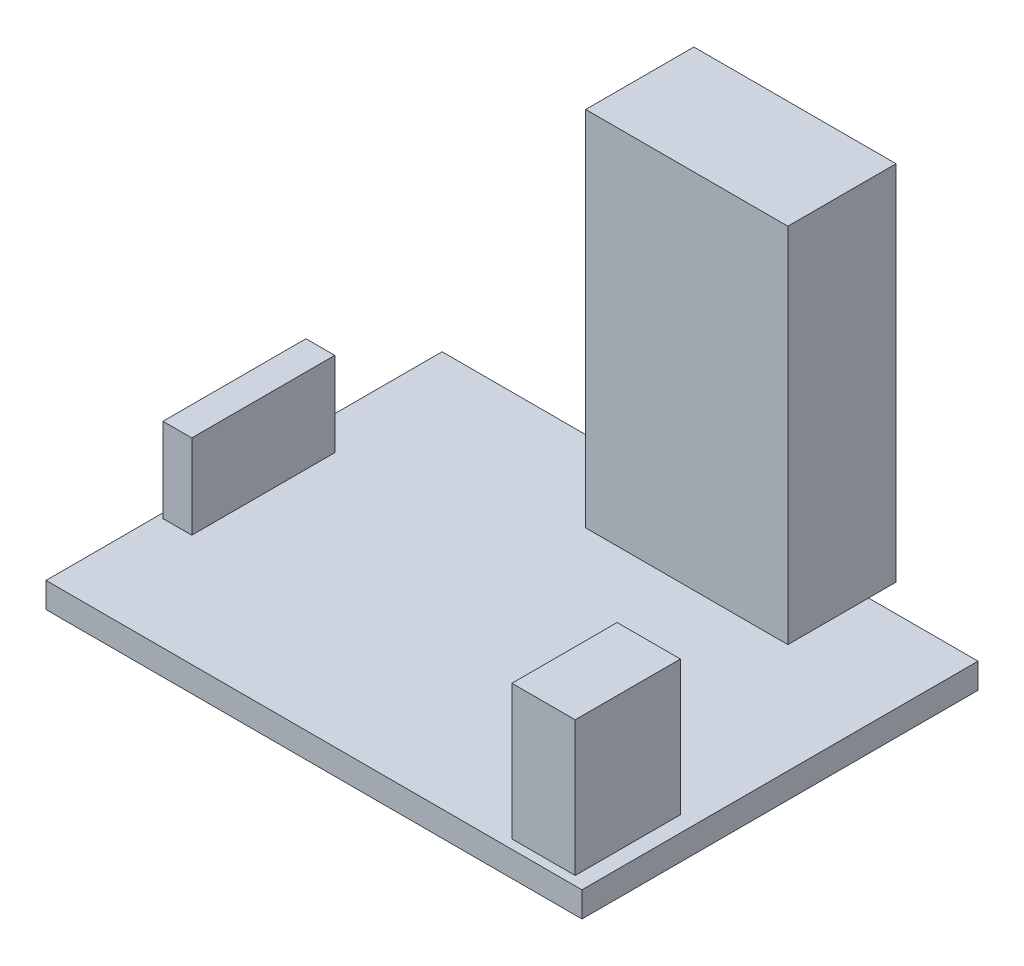
ISO-10303-21;
HEADER;
FILE_DESCRIPTION(('STEP AP214'),'2;1');
FILE_NAME('part.step','',(''),(''),'','','');
FILE_SCHEMA(('AUTOMOTIVE_DESIGN { 1 0 10303 214 1 1 1 1 }'));
ENDSEC;
DATA;
#1=APPLICATION_CONTEXT('core data for automotive mechanical design processes');
#2=APPLICATION_PROTOCOL_DEFINITION('international standard','automotive_design',2000,#1);
#3=PRODUCT_CONTEXT('',#1,'mechanical');
#4=PRODUCT('Part','Part','',(#3));
#5=PRODUCT_RELATED_PRODUCT_CATEGORY('part','',(#4));
#6=PRODUCT_DEFINITION_FORMATION('','',#4);
#7=PRODUCT_DEFINITION_CONTEXT('part definition',#1,'design');
#8=PRODUCT_DEFINITION('design','',#6,#7);
#9=PRODUCT_DEFINITION_SHAPE('','',#8);
#10=(LENGTH_UNIT() NAMED_UNIT(*) SI_UNIT(.MILLI.,.METRE.));
#11=(NAMED_UNIT(*) PLANE_ANGLE_UNIT() SI_UNIT($,.RADIAN.));
#12=(NAMED_UNIT(*) SI_UNIT($,.STERADIAN.) SOLID_ANGLE_UNIT());
#13=UNCERTAINTY_MEASURE_WITH_UNIT(LENGTH_MEASURE(1.E-05),#10,'distance_accuracy_value','');
#14=(GEOMETRIC_REPRESENTATION_CONTEXT(3) GLOBAL_UNCERTAINTY_ASSIGNED_CONTEXT((#13)) GLOBAL_UNIT_ASSIGNED_CONTEXT((#10,
#11,#12)) REPRESENTATION_CONTEXT('',''));
#15=CARTESIAN_POINT('',(0.,0.,0.));
#16=DIRECTION('',(0.,0.,1.));
#17=DIRECTION('',(1.,0.,0.));
#18=AXIS2_PLACEMENT_3D('',#15,#16,#17);
#19=CARTESIAN_POINT('',(0.,1.5,0.));
#20=DIRECTION('',(0.,1.,0.));
#21=DIRECTION('',(0.,0.,1.));
#22=AXIS2_PLACEMENT_3D('',#19,#20,#21);
#23=PLANE('',#22);
#24=DIRECTION('',(1.,0.,0.));
#25=VECTOR('',#24,1.);
#26=CARTESIAN_POINT('',(0.293052926155996,1.5,16.8542686501201));
#27=LINE('',#26,#25);
#28=CARTESIAN_POINT('',(0.293052926155996,1.5,16.8542686501201));
#29=VERTEX_POINT('',#28);
#30=CARTESIAN_POINT('',(2.00371052825782,1.5,16.8542686501201));
#31=VERTEX_POINT('',#30);
#32=EDGE_CURVE('E224',#29,#31,#27,.T.);
#33=ORIENTED_EDGE('',*,*,#32,.F.);
#34=DIRECTION('',(0.,0.,1.));
#35=VECTOR('',#34,1.);
#36=CARTESIAN_POINT('',(0.293052926155996,1.5,8.36762963709548));
#37=LINE('',#36,#35);
#38=CARTESIAN_POINT('',(0.293052926155996,1.5,8.36762963709548));
#39=VERTEX_POINT('',#38);
#40=EDGE_CURVE('E210',#39,#29,#37,.T.);
#41=ORIENTED_EDGE('',*,*,#40,.F.);
#42=DIRECTION('',(-1.,0.,0.));
#43=VECTOR('',#42,1.);
#44=CARTESIAN_POINT('',(0.293052926155996,1.5,8.36762963709548));
#45=LINE('',#44,#43);
#46=CARTESIAN_POINT('',(2.00371052825782,1.5,8.36762963709548));
#47=VERTEX_POINT('',#46);
#48=EDGE_CURVE('E215',#47,#39,#45,.T.);
#49=ORIENTED_EDGE('',*,*,#48,.F.);
#50=DIRECTION('',(0.,0.,-1.));
#51=VECTOR('',#50,1.);
#52=CARTESIAN_POINT('',(2.00371052825782,1.5,8.36762963709548));
#53=LINE('',#52,#51);
#54=EDGE_CURVE('E226',#31,#47,#53,.T.);
#55=ORIENTED_EDGE('',*,*,#54,.F.);
#56=EDGE_LOOP('',(#33,#41,#49,#55));
#57=FACE_BOUND('',#56,.T.);
#58=DIRECTION('',(-1.,0.,0.));
#59=VECTOR('',#58,1.);
#60=CARTESIAN_POINT('',(30.8627264390405,1.5,16.7209706551511));
#61=LINE('',#60,#59);
#62=CARTESIAN_POINT('',(30.8627264390405,1.5,16.7209706551511));
#63=VERTEX_POINT('',#62);
#64=CARTESIAN_POINT('',(27.1081662474144,1.5,16.7209706551511));
#65=VERTEX_POINT('',#64);
#66=EDGE_CURVE('E179',#63,#65,#61,.T.);
#67=ORIENTED_EDGE('',*,*,#66,.F.);
#68=DIRECTION('',(0.,0.,-1.));
#69=VECTOR('',#68,1.);
#70=CARTESIAN_POINT('',(30.8627264390405,1.5,16.7209706551511));
#71=LINE('',#70,#69);
#72=CARTESIAN_POINT('',(30.8627264390405,1.5,22.9637600861981));
#73=VERTEX_POINT('',#72);
#74=EDGE_CURVE('E176',#73,#63,#71,.T.);
#75=ORIENTED_EDGE('',*,*,#74,.F.);
#76=DIRECTION('',(1.,0.,0.));
#77=VECTOR('',#76,1.);
#78=CARTESIAN_POINT('',(30.8627264390405,1.5,22.9637600861981));
#79=LINE('',#78,#77);
#80=CARTESIAN_POINT('',(27.1081662474144,1.5,22.9637600861981));
#81=VERTEX_POINT('',#80);
#82=EDGE_CURVE('E189',#81,#73,#79,.T.);
#83=ORIENTED_EDGE('',*,*,#82,.F.);
#84=DIRECTION('',(0.,0.,1.));
#85=VECTOR('',#84,1.);
#86=CARTESIAN_POINT('',(27.1081662474144,1.5,16.7209706551511));
#87=LINE('',#86,#85);
#88=EDGE_CURVE('E197',#65,#81,#87,.T.);
#89=ORIENTED_EDGE('',*,*,#88,.F.);
#90=EDGE_LOOP('',(#67,#75,#83,#89));
#91=FACE_BOUND('',#90,.T.);
#92=DIRECTION('',(1.,0.,0.));
#93=VECTOR('',#92,1.);
#94=CARTESIAN_POINT('',(13.3118237681257,1.5,4.79080010542806));
#95=LINE('',#94,#93);
#96=CARTESIAN_POINT('',(13.3118237681257,1.5,4.79080010542806));
#97=VERTEX_POINT('',#96);
#98=CARTESIAN_POINT('',(25.3086433153333,1.5,4.79080010542806));
#99=VERTEX_POINT('',#98);
#100=EDGE_CURVE('E48',#97,#99,#95,.T.);
#101=ORIENTED_EDGE('',*,*,#100,.F.);
#102=DIRECTION('',(0.,0.,1.));
#103=VECTOR('',#102,1.);
#104=CARTESIAN_POINT('',(13.3118237681257,1.5,4.79080010542806));
#105=LINE('',#104,#103);
#106=CARTESIAN_POINT('',(13.3118237681257,1.5,0.));
#107=VERTEX_POINT('',#106);
#108=EDGE_CURVE('E175',#107,#97,#105,.T.);
#109=ORIENTED_EDGE('',*,*,#108,.F.);
#110=DIRECTION('',(-1.,0.,0.));
#111=VECTOR('',#110,1.);
#112=CARTESIAN_POINT('',(0.,1.5,0.));
#113=LINE('',#112,#111);
#114=CARTESIAN_POINT('',(0.,1.5,0.));
#115=VERTEX_POINT('',#114);
#116=EDGE_CURVE('E248',#107,#115,#113,.T.);
#117=ORIENTED_EDGE('',*,*,#116,.T.);
#118=DIRECTION('',(0.,0.,1.));
#119=VECTOR('',#118,1.);
#120=CARTESIAN_POINT('',(0.,1.5,0.));
#121=LINE('',#120,#119);
#122=CARTESIAN_POINT('',(0.,1.5,23.5));
#123=VERTEX_POINT('',#122);
#124=EDGE_CURVE('E240',#115,#123,#121,.T.);
#125=ORIENTED_EDGE('',*,*,#124,.T.);
#126=DIRECTION('',(1.,0.,0.));
#127=VECTOR('',#126,1.);
#128=CARTESIAN_POINT('',(0.,1.5,23.5));
#129=LINE('',#128,#127);
#130=CARTESIAN_POINT('',(31.8,1.5,23.5));
#131=VERTEX_POINT('',#130);
#132=EDGE_CURVE('E243',#123,#131,#129,.T.);
#133=ORIENTED_EDGE('',*,*,#132,.T.);
#134=DIRECTION('',(0.,0.,-1.));
#135=VECTOR('',#134,1.);
#136=CARTESIAN_POINT('',(31.8,1.5,0.));
#137=LINE('',#136,#135);
#138=CARTESIAN_POINT('',(31.8,1.5,0.));
#139=VERTEX_POINT('',#138);
#140=EDGE_CURVE('E246',#131,#139,#137,.T.);
#141=ORIENTED_EDGE('',*,*,#140,.T.);
#142=CARTESIAN_POINT('',(25.3086433153333,1.5,0.));
#143=VERTEX_POINT('',#142);
#144=EDGE_CURVE('E249',#139,#143,#113,.T.);
#145=ORIENTED_EDGE('',*,*,#144,.T.);
#146=DIRECTION('',(0.,0.,-1.));
#147=VECTOR('',#146,1.);
#148=CARTESIAN_POINT('',(25.3086433153333,1.5,4.79080010542806));
#149=LINE('',#148,#147);
#150=EDGE_CURVE('E53',#99,#143,#149,.T.);
#151=ORIENTED_EDGE('',*,*,#150,.F.);
#152=EDGE_LOOP('',(#101,#109,#117,#125,#133,#141,#145,#151));
#153=FACE_BOUND('',#152,.T.);
#154=ADVANCED_FACE('F33',(#57,#91,#153),#23,.T.);
#155=CARTESIAN_POINT('',(0.,1.5,0.));
#156=DIRECTION('',(1.,0.,0.));
#157=DIRECTION('',(0.,0.,-1.));
#158=AXIS2_PLACEMENT_3D('',#155,#156,#157);
#159=PLANE('',#158);
#160=DIRECTION('',(0.,0.,1.));
#161=VECTOR('',#160,1.);
#162=CARTESIAN_POINT('',(0.,0.,0.));
#163=LINE('',#162,#161);
#164=CARTESIAN_POINT('',(0.,0.,0.));
#165=VERTEX_POINT('',#164);
#166=CARTESIAN_POINT('',(0.,0.,23.5));
#167=VERTEX_POINT('',#166);
#168=EDGE_CURVE('E239',#165,#167,#163,.T.);
#169=ORIENTED_EDGE('',*,*,#168,.T.);
#170=DIRECTION('',(0.,-1.,0.));
#171=VECTOR('',#170,1.);
#172=CARTESIAN_POINT('',(0.,1.5,23.5));
#173=LINE('',#172,#171);
#174=EDGE_CURVE('E11',#123,#167,#173,.T.);
#175=ORIENTED_EDGE('',*,*,#174,.F.);
#176=ORIENTED_EDGE('',*,*,#124,.F.);
#177=DIRECTION('',(0.,-1.,0.));
#178=VECTOR('',#177,1.);
#179=CARTESIAN_POINT('',(0.,1.5,0.));
#180=LINE('',#179,#178);
#181=EDGE_CURVE('E251',#115,#165,#180,.T.);
#182=ORIENTED_EDGE('',*,*,#181,.T.);
#183=EDGE_LOOP('',(#169,#175,#176,#182));
#184=FACE_BOUND('',#183,.T.);
#185=ADVANCED_FACE('F35',(#184),#159,.F.);
#186=CARTESIAN_POINT('',(0.,1.5,23.5));
#187=DIRECTION('',(0.,0.,-1.));
#188=DIRECTION('',(-1.,0.,0.));
#189=AXIS2_PLACEMENT_3D('',#186,#187,#188);
#190=PLANE('',#189);
#191=DIRECTION('',(1.,0.,0.));
#192=VECTOR('',#191,1.);
#193=CARTESIAN_POINT('',(0.,0.,23.5));
#194=LINE('',#193,#192);
#195=CARTESIAN_POINT('',(31.8,0.,23.5));
#196=VERTEX_POINT('',#195);
#197=EDGE_CURVE('E255',#167,#196,#194,.T.);
#198=ORIENTED_EDGE('',*,*,#197,.T.);
#199=DIRECTION('',(0.,-1.,0.));
#200=VECTOR('',#199,1.);
#201=CARTESIAN_POINT('',(31.8,1.5,23.5));
#202=LINE('',#201,#200);
#203=EDGE_CURVE('E41',#131,#196,#202,.T.);
#204=ORIENTED_EDGE('',*,*,#203,.F.);
#205=ORIENTED_EDGE('',*,*,#132,.F.);
#206=ORIENTED_EDGE('',*,*,#174,.T.);
#207=EDGE_LOOP('',(#198,#204,#205,#206));
#208=FACE_BOUND('',#207,.T.);
#209=ADVANCED_FACE('F319',(#208),#190,.F.);
#210=CARTESIAN_POINT('',(31.8,1.5,0.));
#211=DIRECTION('',(-1.,0.,0.));
#212=DIRECTION('',(0.,0.,1.));
#213=AXIS2_PLACEMENT_3D('',#210,#211,#212);
#214=PLANE('',#213);
#215=DIRECTION('',(0.,0.,-1.));
#216=VECTOR('',#215,1.);
#217=CARTESIAN_POINT('',(31.8,0.,0.));
#218=LINE('',#217,#216);
#219=CARTESIAN_POINT('',(31.8,0.,0.));
#220=VERTEX_POINT('',#219);
#221=EDGE_CURVE('E257',#196,#220,#218,.T.);
#222=ORIENTED_EDGE('',*,*,#221,.T.);
#223=DIRECTION('',(0.,-1.,0.));
#224=VECTOR('',#223,1.);
#225=CARTESIAN_POINT('',(31.8,1.5,0.));
#226=LINE('',#225,#224);
#227=EDGE_CURVE('E262',#139,#220,#226,.T.);
#228=ORIENTED_EDGE('',*,*,#227,.F.);
#229=ORIENTED_EDGE('',*,*,#140,.F.);
#230=ORIENTED_EDGE('',*,*,#203,.T.);
#231=EDGE_LOOP('',(#222,#228,#229,#230));
#232=FACE_BOUND('',#231,.T.);
#233=ADVANCED_FACE('F269',(#232),#214,.F.);
#234=CARTESIAN_POINT('',(0.,1.5,0.));
#235=DIRECTION('',(0.,0.,1.));
#236=DIRECTION('',(1.,0.,0.));
#237=AXIS2_PLACEMENT_3D('',#234,#235,#236);
#238=PLANE('',#237);
#239=DIRECTION('',(-1.,0.,0.));
#240=VECTOR('',#239,1.);
#241=CARTESIAN_POINT('',(0.,0.,0.));
#242=LINE('',#241,#240);
#243=EDGE_CURVE('E244',#220,#165,#242,.T.);
#244=ORIENTED_EDGE('',*,*,#243,.T.);
#245=ORIENTED_EDGE('',*,*,#181,.F.);
#246=ORIENTED_EDGE('',*,*,#116,.F.);
#247=EDGE_CURVE('E252',#143,#107,#113,.T.);
#248=ORIENTED_EDGE('',*,*,#247,.F.);
#249=ORIENTED_EDGE('',*,*,#144,.F.);
#250=ORIENTED_EDGE('',*,*,#227,.T.);
#251=EDGE_LOOP('',(#244,#245,#246,#248,#249,#250));
#252=FACE_BOUND('',#251,.T.);
#253=ADVANCED_FACE('F278',(#252),#238,.F.);
#254=CARTESIAN_POINT('',(0.,0.,0.));
#255=DIRECTION('',(0.,1.,0.));
#256=DIRECTION('',(0.,0.,1.));
#257=AXIS2_PLACEMENT_3D('',#254,#255,#256);
#258=PLANE('',#257);
#259=ORIENTED_EDGE('',*,*,#168,.F.);
#260=ORIENTED_EDGE('',*,*,#243,.F.);
#261=ORIENTED_EDGE('',*,*,#221,.F.);
#262=ORIENTED_EDGE('',*,*,#197,.F.);
#263=EDGE_LOOP('',(#259,#260,#261,#262));
#264=FACE_BOUND('',#263,.T.);
#265=ADVANCED_FACE('F275',(#264),#258,.F.);
#266=CARTESIAN_POINT('',(0.293052926155996,6.5,8.36762963709548));
#267=DIRECTION('',(1.,0.,0.));
#268=DIRECTION('',(0.,0.,-1.));
#269=AXIS2_PLACEMENT_3D('',#266,#267,#268);
#270=PLANE('',#269);
#271=ORIENTED_EDGE('',*,*,#40,.T.);
#272=DIRECTION('',(0.,-1.,0.));
#273=VECTOR('',#272,1.);
#274=CARTESIAN_POINT('',(0.293052926155996,6.5,16.8542686501201));
#275=LINE('',#274,#273);
#276=CARTESIAN_POINT('',(0.293052926155996,6.5,16.8542686501201));
#277=VERTEX_POINT('',#276);
#278=EDGE_CURVE('E237',#277,#29,#275,.T.);
#279=ORIENTED_EDGE('',*,*,#278,.F.);
#280=DIRECTION('',(0.,0.,1.));
#281=VECTOR('',#280,1.);
#282=CARTESIAN_POINT('',(0.293052926155996,6.5,8.36762963709548));
#283=LINE('',#282,#281);
#284=CARTESIAN_POINT('',(0.293052926155996,6.5,8.36762963709548));
#285=VERTEX_POINT('',#284);
#286=EDGE_CURVE('E211',#285,#277,#283,.T.);
#287=ORIENTED_EDGE('',*,*,#286,.F.);
#288=DIRECTION('',(0.,-1.,0.));
#289=VECTOR('',#288,1.);
#290=CARTESIAN_POINT('',(0.293052926155996,6.5,8.36762963709548));
#291=LINE('',#290,#289);
#292=EDGE_CURVE('E221',#285,#39,#291,.T.);
#293=ORIENTED_EDGE('',*,*,#292,.T.);
#294=EDGE_LOOP('',(#271,#279,#287,#293));
#295=FACE_BOUND('',#294,.T.);
#296=ADVANCED_FACE('F324',(#295),#270,.F.);
#297=CARTESIAN_POINT('',(0.293052926155996,6.5,16.8542686501201));
#298=DIRECTION('',(0.,0.,-1.));
#299=DIRECTION('',(-1.,0.,0.));
#300=AXIS2_PLACEMENT_3D('',#297,#298,#299);
#301=PLANE('',#300);
#302=ORIENTED_EDGE('',*,*,#32,.T.);
#303=DIRECTION('',(0.,-1.,0.));
#304=VECTOR('',#303,1.);
#305=CARTESIAN_POINT('',(2.00371052825782,6.5,16.8542686501201));
#306=LINE('',#305,#304);
#307=CARTESIAN_POINT('',(2.00371052825782,6.5,16.8542686501201));
#308=VERTEX_POINT('',#307);
#309=EDGE_CURVE('E234',#308,#31,#306,.T.);
#310=ORIENTED_EDGE('',*,*,#309,.F.);
#311=DIRECTION('',(1.,0.,0.));
#312=VECTOR('',#311,1.);
#313=CARTESIAN_POINT('',(0.293052926155996,6.5,16.8542686501201));
#314=LINE('',#313,#312);
#315=EDGE_CURVE('E214',#277,#308,#314,.T.);
#316=ORIENTED_EDGE('',*,*,#315,.F.);
#317=ORIENTED_EDGE('',*,*,#278,.T.);
#318=EDGE_LOOP('',(#302,#310,#316,#317));
#319=FACE_BOUND('',#318,.T.);
#320=ADVANCED_FACE('F355',(#319),#301,.F.);
#321=CARTESIAN_POINT('',(2.00371052825782,6.5,8.36762963709548));
#322=DIRECTION('',(-1.,0.,0.));
#323=DIRECTION('',(0.,0.,1.));
#324=AXIS2_PLACEMENT_3D('',#321,#322,#323);
#325=PLANE('',#324);
#326=ORIENTED_EDGE('',*,*,#54,.T.);
#327=DIRECTION('',(0.,-1.,0.));
#328=VECTOR('',#327,1.);
#329=CARTESIAN_POINT('',(2.00371052825782,6.5,8.36762963709548));
#330=LINE('',#329,#328);
#331=CARTESIAN_POINT('',(2.00371052825782,6.5,8.36762963709548));
#332=VERTEX_POINT('',#331);
#333=EDGE_CURVE('E232',#332,#47,#330,.T.);
#334=ORIENTED_EDGE('',*,*,#333,.F.);
#335=DIRECTION('',(0.,0.,-1.));
#336=VECTOR('',#335,1.);
#337=CARTESIAN_POINT('',(2.00371052825782,6.5,8.36762963709548));
#338=LINE('',#337,#336);
#339=EDGE_CURVE('E217',#308,#332,#338,.T.);
#340=ORIENTED_EDGE('',*,*,#339,.F.);
#341=ORIENTED_EDGE('',*,*,#309,.T.);
#342=EDGE_LOOP('',(#326,#334,#340,#341));
#343=FACE_BOUND('',#342,.T.);
#344=ADVANCED_FACE('F362',(#343),#325,.F.);
#345=CARTESIAN_POINT('',(0.293052926155996,6.5,8.36762963709548));
#346=DIRECTION('',(0.,0.,1.));
#347=DIRECTION('',(1.,0.,0.));
#348=AXIS2_PLACEMENT_3D('',#345,#346,#347);
#349=PLANE('',#348);
#350=ORIENTED_EDGE('',*,*,#48,.T.);
#351=ORIENTED_EDGE('',*,*,#292,.F.);
#352=DIRECTION('',(-1.,0.,0.));
#353=VECTOR('',#352,1.);
#354=CARTESIAN_POINT('',(0.293052926155996,6.5,8.36762963709548));
#355=LINE('',#354,#353);
#356=EDGE_CURVE('E219',#332,#285,#355,.T.);
#357=ORIENTED_EDGE('',*,*,#356,.F.);
#358=ORIENTED_EDGE('',*,*,#333,.T.);
#359=EDGE_LOOP('',(#350,#351,#357,#358));
#360=FACE_BOUND('',#359,.T.);
#361=ADVANCED_FACE('F369',(#360),#349,.F.);
#362=CARTESIAN_POINT('',(0.,6.5,0.));
#363=DIRECTION('',(0.,1.,0.));
#364=DIRECTION('',(0.,0.,1.));
#365=AXIS2_PLACEMENT_3D('',#362,#363,#364);
#366=PLANE('',#365);
#367=ORIENTED_EDGE('',*,*,#286,.T.);
#368=ORIENTED_EDGE('',*,*,#315,.T.);
#369=ORIENTED_EDGE('',*,*,#339,.T.);
#370=ORIENTED_EDGE('',*,*,#356,.T.);
#371=EDGE_LOOP('',(#367,#368,#369,#370));
#372=FACE_BOUND('',#371,.T.);
#373=ADVANCED_FACE('F377',(#372),#366,.T.);
#374=CARTESIAN_POINT('',(30.8627264390405,9.5,16.7209706551511));
#375=DIRECTION('',(-1.,0.,0.));
#376=DIRECTION('',(0.,0.,1.));
#377=AXIS2_PLACEMENT_3D('',#374,#375,#376);
#378=PLANE('',#377);
#379=ORIENTED_EDGE('',*,*,#74,.T.);
#380=DIRECTION('',(0.,-1.,0.));
#381=VECTOR('',#380,1.);
#382=CARTESIAN_POINT('',(30.8627264390405,9.5,16.7209706551511));
#383=LINE('',#382,#381);
#384=CARTESIAN_POINT('',(30.8627264390405,9.5,16.7209706551511));
#385=VERTEX_POINT('',#384);
#386=EDGE_CURVE('E208',#385,#63,#383,.T.);
#387=ORIENTED_EDGE('',*,*,#386,.F.);
#388=DIRECTION('',(0.,0.,-1.));
#389=VECTOR('',#388,1.);
#390=CARTESIAN_POINT('',(30.8627264390405,9.5,16.7209706551511));
#391=LINE('',#390,#389);
#392=CARTESIAN_POINT('',(30.8627264390405,9.5,22.9637600861981));
#393=VERTEX_POINT('',#392);
#394=EDGE_CURVE('E185',#393,#385,#391,.T.);
#395=ORIENTED_EDGE('',*,*,#394,.F.);
#396=DIRECTION('',(0.,-1.,0.));
#397=VECTOR('',#396,1.);
#398=CARTESIAN_POINT('',(30.8627264390405,9.5,22.9637600861981));
#399=LINE('',#398,#397);
#400=EDGE_CURVE('E194',#393,#73,#399,.T.);
#401=ORIENTED_EDGE('',*,*,#400,.T.);
#402=EDGE_LOOP('',(#379,#387,#395,#401));
#403=FACE_BOUND('',#402,.T.);
#404=ADVANCED_FACE('F385',(#403),#378,.F.);
#405=CARTESIAN_POINT('',(30.8627264390405,9.5,16.7209706551511));
#406=DIRECTION('',(0.,0.,1.));
#407=DIRECTION('',(1.,0.,0.));
#408=AXIS2_PLACEMENT_3D('',#405,#406,#407);
#409=PLANE('',#408);
#410=ORIENTED_EDGE('',*,*,#66,.T.);
#411=DIRECTION('',(0.,-1.,0.));
#412=VECTOR('',#411,1.);
#413=CARTESIAN_POINT('',(27.1081662474144,9.5,16.7209706551511));
#414=LINE('',#413,#412);
#415=CARTESIAN_POINT('',(27.1081662474144,9.5,16.7209706551511));
#416=VERTEX_POINT('',#415);
#417=EDGE_CURVE('E205',#416,#65,#414,.T.);
#418=ORIENTED_EDGE('',*,*,#417,.F.);
#419=DIRECTION('',(-1.,0.,0.));
#420=VECTOR('',#419,1.);
#421=CARTESIAN_POINT('',(30.8627264390405,9.5,16.7209706551511));
#422=LINE('',#421,#420);
#423=EDGE_CURVE('E188',#385,#416,#422,.T.);
#424=ORIENTED_EDGE('',*,*,#423,.F.);
#425=ORIENTED_EDGE('',*,*,#386,.T.);
#426=EDGE_LOOP('',(#410,#418,#424,#425));
#427=FACE_BOUND('',#426,.T.);
#428=ADVANCED_FACE('F393',(#427),#409,.F.);
#429=CARTESIAN_POINT('',(27.1081662474144,9.5,16.7209706551511));
#430=DIRECTION('',(1.,0.,0.));
#431=DIRECTION('',(0.,0.,-1.));
#432=AXIS2_PLACEMENT_3D('',#429,#430,#431);
#433=PLANE('',#432);
#434=ORIENTED_EDGE('',*,*,#88,.T.);
#435=DIRECTION('',(0.,-1.,0.));
#436=VECTOR('',#435,1.);
#437=CARTESIAN_POINT('',(27.1081662474144,9.5,22.9637600861981));
#438=LINE('',#437,#436);
#439=CARTESIAN_POINT('',(27.1081662474144,9.5,22.9637600861981));
#440=VERTEX_POINT('',#439);
#441=EDGE_CURVE('E203',#440,#81,#438,.T.);
#442=ORIENTED_EDGE('',*,*,#441,.F.);
#443=DIRECTION('',(0.,0.,1.));
#444=VECTOR('',#443,1.);
#445=CARTESIAN_POINT('',(27.1081662474144,9.5,16.7209706551511));
#446=LINE('',#445,#444);
#447=EDGE_CURVE('E191',#416,#440,#446,.T.);
#448=ORIENTED_EDGE('',*,*,#447,.F.);
#449=ORIENTED_EDGE('',*,*,#417,.T.);
#450=EDGE_LOOP('',(#434,#442,#448,#449));
#451=FACE_BOUND('',#450,.T.);
#452=ADVANCED_FACE('F401',(#451),#433,.F.);
#453=CARTESIAN_POINT('',(30.8627264390405,9.5,22.9637600861981));
#454=DIRECTION('',(0.,0.,-1.));
#455=DIRECTION('',(-1.,0.,0.));
#456=AXIS2_PLACEMENT_3D('',#453,#454,#455);
#457=PLANE('',#456);
#458=ORIENTED_EDGE('',*,*,#82,.T.);
#459=ORIENTED_EDGE('',*,*,#400,.F.);
#460=DIRECTION('',(1.,0.,0.));
#461=VECTOR('',#460,1.);
#462=CARTESIAN_POINT('',(30.8627264390405,9.5,22.9637600861981));
#463=LINE('',#462,#461);
#464=EDGE_CURVE('E193',#440,#393,#463,.T.);
#465=ORIENTED_EDGE('',*,*,#464,.F.);
#466=ORIENTED_EDGE('',*,*,#441,.T.);
#467=EDGE_LOOP('',(#458,#459,#465,#466));
#468=FACE_BOUND('',#467,.T.);
#469=ADVANCED_FACE('F409',(#468),#457,.F.);
#470=CARTESIAN_POINT('',(0.,9.5,0.));
#471=DIRECTION('',(0.,-1.,0.));
#472=DIRECTION('',(0.,0.,-1.));
#473=AXIS2_PLACEMENT_3D('',#470,#471,#472);
#474=PLANE('',#473);
#475=ORIENTED_EDGE('',*,*,#394,.T.);
#476=ORIENTED_EDGE('',*,*,#423,.T.);
#477=ORIENTED_EDGE('',*,*,#447,.T.);
#478=ORIENTED_EDGE('',*,*,#464,.T.);
#479=EDGE_LOOP('',(#475,#476,#477,#478));
#480=FACE_BOUND('',#479,.T.);
#481=ADVANCED_FACE('F417',(#480),#474,.F.);
#482=CARTESIAN_POINT('',(0.,1.5,0.));
#483=DIRECTION('',(0.,-1.,0.));
#484=DIRECTION('',(0.,0.,-1.));
#485=AXIS2_PLACEMENT_3D('',#482,#483,#484);
#486=PLANE('',#485);
#487=ORIENTED_EDGE('',*,*,#247,.T.);
#488=CARTESIAN_POINT('',(13.3118237681257,1.5,-1.62971998557748));
#489=VERTEX_POINT('',#488);
#490=EDGE_CURVE('E289',#489,#107,#105,.T.);
#491=ORIENTED_EDGE('',*,*,#490,.F.);
#492=DIRECTION('',(-1.,0.,0.));
#493=VECTOR('',#492,1.);
#494=CARTESIAN_POINT('',(13.3118237681257,1.5,-1.62971998557748));
#495=LINE('',#494,#493);
#496=CARTESIAN_POINT('',(25.3086433153333,1.5,-1.62971998557748));
#497=VERTEX_POINT('',#496);
#498=EDGE_CURVE('E171',#497,#489,#495,.T.);
#499=ORIENTED_EDGE('',*,*,#498,.F.);
#500=EDGE_CURVE('E290',#143,#497,#149,.T.);
#501=ORIENTED_EDGE('',*,*,#500,.F.);
#502=EDGE_LOOP('',(#487,#491,#499,#501));
#503=FACE_BOUND('',#502,.T.);
#504=ADVANCED_FACE('F287',(#503),#486,.T.);
#505=CARTESIAN_POINT('',(13.3118237681257,23.,4.79080010542806));
#506=DIRECTION('',(1.,0.,0.));
#507=DIRECTION('',(0.,0.,-1.));
#508=AXIS2_PLACEMENT_3D('',#505,#506,#507);
#509=PLANE('',#508);
#510=ORIENTED_EDGE('',*,*,#490,.T.);
#511=ORIENTED_EDGE('',*,*,#108,.T.);
#512=DIRECTION('',(0.,-1.,0.));
#513=VECTOR('',#512,1.);
#514=CARTESIAN_POINT('',(13.3118237681257,23.,4.79080010542806));
#515=LINE('',#514,#513);
#516=CARTESIAN_POINT('',(13.3118237681257,23.,4.79080010542806));
#517=VERTEX_POINT('',#516);
#518=EDGE_CURVE('E156',#517,#97,#515,.T.);
#519=ORIENTED_EDGE('',*,*,#518,.F.);
#520=DIRECTION('',(0.,0.,1.));
#521=VECTOR('',#520,1.);
#522=CARTESIAN_POINT('',(13.3118237681257,23.,4.79080010542806));
#523=LINE('',#522,#521);
#524=CARTESIAN_POINT('',(13.3118237681257,23.,-1.62971998557748));
#525=VERTEX_POINT('',#524);
#526=EDGE_CURVE('E162',#525,#517,#523,.T.);
#527=ORIENTED_EDGE('',*,*,#526,.F.);
#528=DIRECTION('',(0.,-1.,0.));
#529=VECTOR('',#528,1.);
#530=CARTESIAN_POINT('',(13.3118237681257,23.,-1.62971998557748));
#531=LINE('',#530,#529);
#532=EDGE_CURVE('E291',#525,#489,#531,.T.);
#533=ORIENTED_EDGE('',*,*,#532,.T.);
#534=EDGE_LOOP('',(#510,#511,#519,#527,#533));
#535=FACE_BOUND('',#534,.T.);
#536=ADVANCED_FACE('F174',(#535),#509,.F.);
#537=CARTESIAN_POINT('',(13.3118237681257,23.,4.79080010542806));
#538=DIRECTION('',(0.,0.,-1.));
#539=DIRECTION('',(-1.,0.,0.));
#540=AXIS2_PLACEMENT_3D('',#537,#538,#539);
#541=PLANE('',#540);
#542=ORIENTED_EDGE('',*,*,#100,.T.);
#543=DIRECTION('',(0.,-1.,0.));
#544=VECTOR('',#543,1.);
#545=CARTESIAN_POINT('',(25.3086433153333,23.,4.79080010542806));
#546=LINE('',#545,#544);
#547=CARTESIAN_POINT('',(25.3086433153333,23.,4.79080010542806));
#548=VERTEX_POINT('',#547);
#549=EDGE_CURVE('E158',#548,#99,#546,.T.);
#550=ORIENTED_EDGE('',*,*,#549,.F.);
#551=DIRECTION('',(1.,0.,0.));
#552=VECTOR('',#551,1.);
#553=CARTESIAN_POINT('',(13.3118237681257,23.,4.79080010542806));
#554=LINE('',#553,#552);
#555=EDGE_CURVE('E152',#517,#548,#554,.T.);
#556=ORIENTED_EDGE('',*,*,#555,.F.);
#557=ORIENTED_EDGE('',*,*,#518,.T.);
#558=EDGE_LOOP('',(#542,#550,#556,#557));
#559=FACE_BOUND('',#558,.T.);
#560=ADVANCED_FACE('F154',(#559),#541,.F.);
#561=CARTESIAN_POINT('',(25.3086433153333,23.,4.79080010542806));
#562=DIRECTION('',(-1.,0.,0.));
#563=DIRECTION('',(0.,0.,1.));
#564=AXIS2_PLACEMENT_3D('',#561,#562,#563);
#565=PLANE('',#564);
#566=ORIENTED_EDGE('',*,*,#150,.T.);
#567=ORIENTED_EDGE('',*,*,#500,.T.);
#568=DIRECTION('',(0.,-1.,0.));
#569=VECTOR('',#568,1.);
#570=CARTESIAN_POINT('',(25.3086433153333,23.,-1.62971998557748));
#571=LINE('',#570,#569);
#572=CARTESIAN_POINT('',(25.3086433153333,23.,-1.62971998557748));
#573=VERTEX_POINT('',#572);
#574=EDGE_CURVE('E181',#573,#497,#571,.T.);
#575=ORIENTED_EDGE('',*,*,#574,.F.);
#576=DIRECTION('',(0.,0.,-1.));
#577=VECTOR('',#576,1.);
#578=CARTESIAN_POINT('',(25.3086433153333,23.,4.79080010542806));
#579=LINE('',#578,#577);
#580=EDGE_CURVE('E161',#548,#573,#579,.T.);
#581=ORIENTED_EDGE('',*,*,#580,.F.);
#582=ORIENTED_EDGE('',*,*,#549,.T.);
#583=EDGE_LOOP('',(#566,#567,#575,#581,#582));
#584=FACE_BOUND('',#583,.T.);
#585=ADVANCED_FACE('F304',(#584),#565,.F.);
#586=CARTESIAN_POINT('',(13.3118237681257,23.,-1.62971998557748));
#587=DIRECTION('',(0.,0.,1.));
#588=DIRECTION('',(1.,0.,0.));
#589=AXIS2_PLACEMENT_3D('',#586,#587,#588);
#590=PLANE('',#589);
#591=ORIENTED_EDGE('',*,*,#498,.T.);
#592=ORIENTED_EDGE('',*,*,#532,.F.);
#593=DIRECTION('',(-1.,0.,0.));
#594=VECTOR('',#593,1.);
#595=CARTESIAN_POINT('',(13.3118237681257,23.,-1.62971998557748));
#596=LINE('',#595,#594);
#597=EDGE_CURVE('E167',#573,#525,#596,.T.);
#598=ORIENTED_EDGE('',*,*,#597,.F.);
#599=ORIENTED_EDGE('',*,*,#574,.T.);
#600=EDGE_LOOP('',(#591,#592,#598,#599));
#601=FACE_BOUND('',#600,.T.);
#602=ADVANCED_FACE('F302',(#601),#590,.F.);
#603=CARTESIAN_POINT('',(0.,23.,0.));
#604=DIRECTION('',(0.,-1.,0.));
#605=DIRECTION('',(0.,0.,-1.));
#606=AXIS2_PLACEMENT_3D('',#603,#604,#605);
#607=PLANE('',#606);
#608=ORIENTED_EDGE('',*,*,#526,.T.);
#609=ORIENTED_EDGE('',*,*,#555,.T.);
#610=ORIENTED_EDGE('',*,*,#580,.T.);
#611=ORIENTED_EDGE('',*,*,#597,.T.);
#612=EDGE_LOOP('',(#608,#609,#610,#611));
#613=FACE_BOUND('',#612,.T.);
#614=ADVANCED_FACE('F165',(#613),#607,.F.);
#615=CLOSED_SHELL('',(#154,#185,#209,#233,#253,#265,#296,#320,#344,#361,#373,#404,#428,#452,
#469,#481,#504,#536,#560,#585,#602,#614));
#616=MANIFOLD_SOLID_BREP('B2',#615);
#617=ADVANCED_BREP_SHAPE_REPRESENTATION('',(#18,#616),#14);
#618=SHAPE_DEFINITION_REPRESENTATION(#9,#617);
ENDSEC;
END-ISO-10303-21;
